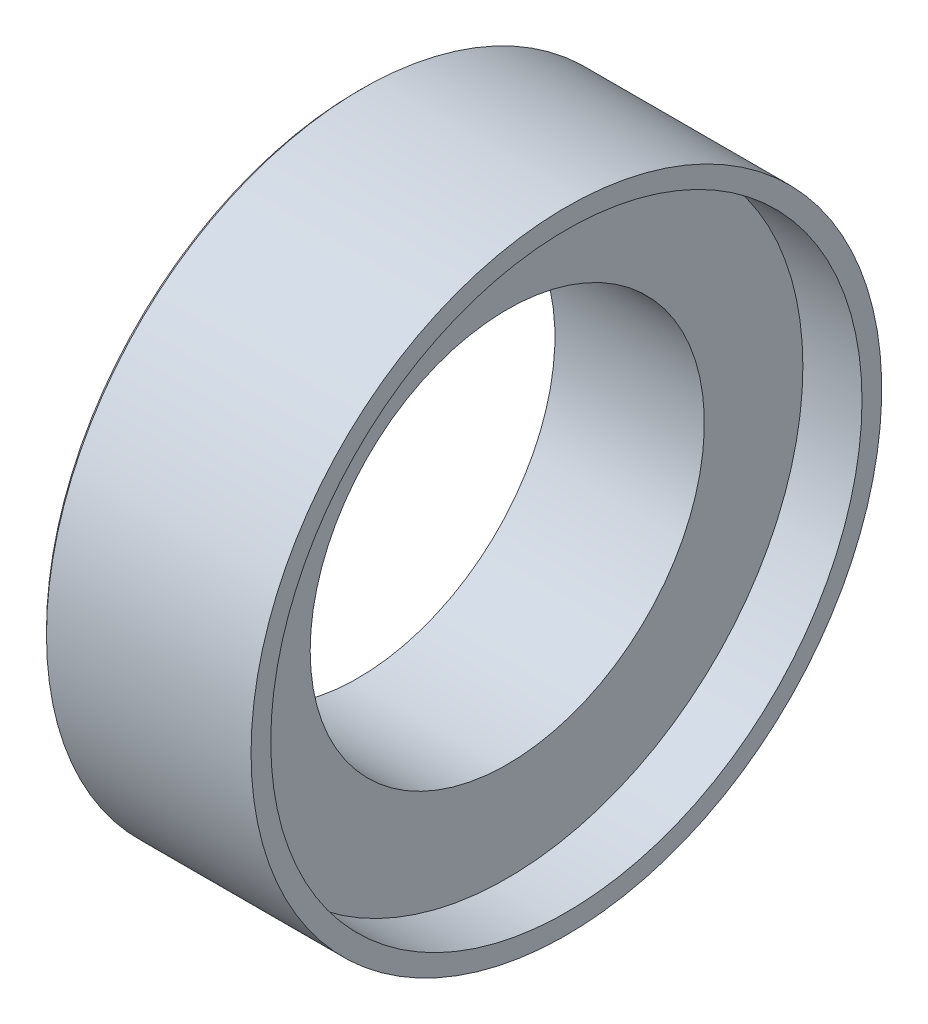
ISO-10303-21;
HEADER;
FILE_DESCRIPTION(('STEP AP214'),'2;1');
FILE_NAME('part.step','',(''),(''),'','','');
FILE_SCHEMA(('AUTOMOTIVE_DESIGN { 1 0 10303 214 1 1 1 1 }'));
ENDSEC;
DATA;
#1=APPLICATION_CONTEXT('core data for automotive mechanical design processes');
#2=APPLICATION_PROTOCOL_DEFINITION('international standard','automotive_design',2000,#1);
#3=PRODUCT_CONTEXT('',#1,'mechanical');
#4=PRODUCT('Part','Part','',(#3));
#5=PRODUCT_RELATED_PRODUCT_CATEGORY('part','',(#4));
#6=PRODUCT_DEFINITION_FORMATION('','',#4);
#7=PRODUCT_DEFINITION_CONTEXT('part definition',#1,'design');
#8=PRODUCT_DEFINITION('design','',#6,#7);
#9=PRODUCT_DEFINITION_SHAPE('','',#8);
#10=(LENGTH_UNIT() NAMED_UNIT(*) SI_UNIT(.MILLI.,.METRE.));
#11=(NAMED_UNIT(*) PLANE_ANGLE_UNIT() SI_UNIT($,.RADIAN.));
#12=(NAMED_UNIT(*) SI_UNIT($,.STERADIAN.) SOLID_ANGLE_UNIT());
#13=UNCERTAINTY_MEASURE_WITH_UNIT(LENGTH_MEASURE(1.E-05),#10,'distance_accuracy_value','');
#14=(GEOMETRIC_REPRESENTATION_CONTEXT(3) GLOBAL_UNCERTAINTY_ASSIGNED_CONTEXT((#13)) GLOBAL_UNIT_ASSIGNED_CONTEXT((#10,
#11,#12)) REPRESENTATION_CONTEXT('',''));
#15=CARTESIAN_POINT('',(0.,0.,0.));
#16=DIRECTION('',(0.,0.,1.));
#17=DIRECTION('',(1.,0.,0.));
#18=AXIS2_PLACEMENT_3D('',#15,#16,#17);
#19=CARTESIAN_POINT('',(20.79,0.,6.5));
#20=DIRECTION('',(1.,0.,0.));
#21=DIRECTION('',(0.,0.,-1.));
#22=AXIS2_PLACEMENT_3D('',#19,#20,#21);
#23=PLANE('',#22);
#24=CARTESIAN_POINT('',(20.79,0.,0.));
#25=DIRECTION('',(-1.,0.,0.));
#26=DIRECTION('',(0.,0.,1.));
#27=AXIS2_PLACEMENT_3D('',#24,#25,#26);
#28=CIRCLE('',#27,5.);
#29=CARTESIAN_POINT('',(20.79,0.,5.));
#30=VERTEX_POINT('',#29);
#31=EDGE_CURVE('E18',#30,#30,#28,.T.);
#32=ORIENTED_EDGE('',*,*,#31,.T.);
#33=EDGE_LOOP('',(#32));
#34=FACE_BOUND('',#33,.T.);
#35=CARTESIAN_POINT('',(20.79,0.,0.));
#36=DIRECTION('',(1.,0.,0.));
#37=DIRECTION('',(0.,0.,-1.));
#38=AXIS2_PLACEMENT_3D('',#35,#36,#37);
#39=CIRCLE('',#38,7.5);
#40=CARTESIAN_POINT('',(20.79,0.,-7.5));
#41=VERTEX_POINT('',#40);
#42=EDGE_CURVE('E37',#41,#41,#39,.T.);
#43=ORIENTED_EDGE('',*,*,#42,.T.);
#44=EDGE_LOOP('',(#43));
#45=FACE_BOUND('',#44,.T.);
#46=ADVANCED_FACE('F15',(#34,#45),#23,.T.);
#47=CARTESIAN_POINT('',(18.895,0.,0.));
#48=DIRECTION('',(-1.,0.,0.));
#49=DIRECTION('',(0.,0.,1.));
#50=AXIS2_PLACEMENT_3D('',#47,#48,#49);
#51=CYLINDRICAL_SURFACE('',#50,5.);
#52=ORIENTED_EDGE('',*,*,#31,.F.);
#53=EDGE_LOOP('',(#52));
#54=FACE_BOUND('',#53,.T.);
#55=CARTESIAN_POINT('',(17.,0.,0.));
#56=DIRECTION('',(-1.,0.,0.));
#57=DIRECTION('',(0.,0.,1.));
#58=AXIS2_PLACEMENT_3D('',#55,#56,#57);
#59=CIRCLE('',#58,5.);
#60=CARTESIAN_POINT('',(17.,0.,5.));
#61=VERTEX_POINT('',#60);
#62=EDGE_CURVE('E35',#61,#61,#59,.F.);
#63=ORIENTED_EDGE('',*,*,#62,.F.);
#64=EDGE_LOOP('',(#63));
#65=FACE_BOUND('',#64,.T.);
#66=ADVANCED_FACE('F45',(#54,#65),#51,.F.);
#67=CARTESIAN_POINT('',(21.54,0.,0.));
#68=DIRECTION('',(1.,0.,0.));
#69=DIRECTION('',(0.,0.,-1.));
#70=AXIS2_PLACEMENT_3D('',#67,#68,#69);
#71=CYLINDRICAL_SURFACE('',#70,7.5);
#72=ORIENTED_EDGE('',*,*,#42,.F.);
#73=EDGE_LOOP('',(#72));
#74=FACE_BOUND('',#73,.T.);
#75=CARTESIAN_POINT('',(22.29,0.,0.));
#76=DIRECTION('',(1.,0.,0.));
#77=DIRECTION('',(0.,0.,-1.));
#78=AXIS2_PLACEMENT_3D('',#75,#76,#77);
#79=CIRCLE('',#78,7.5);
#80=CARTESIAN_POINT('',(22.29,0.,-7.5));
#81=VERTEX_POINT('',#80);
#82=EDGE_CURVE('E32',#81,#81,#79,.F.);
#83=ORIENTED_EDGE('',*,*,#82,.F.);
#84=EDGE_LOOP('',(#83));
#85=FACE_BOUND('',#84,.T.);
#86=ADVANCED_FACE('F48',(#74,#85),#71,.F.);
#87=CARTESIAN_POINT('',(17.,0.,6.5));
#88=DIRECTION('',(-1.,0.,0.));
#89=DIRECTION('',(0.,0.,1.));
#90=AXIS2_PLACEMENT_3D('',#87,#88,#89);
#91=PLANE('',#90);
#92=ORIENTED_EDGE('',*,*,#62,.T.);
#93=EDGE_LOOP('',(#92));
#94=FACE_BOUND('',#93,.T.);
#95=CARTESIAN_POINT('',(17.,0.,0.));
#96=DIRECTION('',(1.,0.,0.));
#97=DIRECTION('',(0.,0.,-1.));
#98=AXIS2_PLACEMENT_3D('',#95,#96,#97);
#99=CIRCLE('',#98,7.9);
#100=CARTESIAN_POINT('',(17.,0.,-7.9));
#101=VERTEX_POINT('',#100);
#102=EDGE_CURVE('E27',#101,#101,#99,.T.);
#103=ORIENTED_EDGE('',*,*,#102,.F.);
#104=EDGE_LOOP('',(#103));
#105=FACE_BOUND('',#104,.T.);
#106=ADVANCED_FACE('F51',(#94,#105),#91,.T.);
#107=CARTESIAN_POINT('',(22.29,0.,7.75));
#108=DIRECTION('',(1.,0.,0.));
#109=DIRECTION('',(0.,0.,-1.));
#110=AXIS2_PLACEMENT_3D('',#107,#108,#109);
#111=PLANE('',#110);
#112=CARTESIAN_POINT('',(22.29,0.,0.));
#113=DIRECTION('',(-1.,0.,0.));
#114=DIRECTION('',(0.,0.,1.));
#115=AXIS2_PLACEMENT_3D('',#112,#113,#114);
#116=CIRCLE('',#115,8.);
#117=CARTESIAN_POINT('',(22.29,0.,8.));
#118=VERTEX_POINT('',#117);
#119=EDGE_CURVE('E22',#118,#118,#116,.T.);
#120=ORIENTED_EDGE('',*,*,#119,.F.);
#121=EDGE_LOOP('',(#120));
#122=FACE_BOUND('',#121,.T.);
#123=ORIENTED_EDGE('',*,*,#82,.T.);
#124=EDGE_LOOP('',(#123));
#125=FACE_BOUND('',#124,.T.);
#126=ADVANCED_FACE('F54',(#122,#125),#111,.T.);
#127=CARTESIAN_POINT('',(17.1,0.,0.));
#128=DIRECTION('',(1.,0.,0.));
#129=DIRECTION('',(0.,0.,-1.));
#130=AXIS2_PLACEMENT_3D('',#127,#128,#129);
#131=CONICAL_SURFACE('',#130,8.,0.785398163397448);
#132=ORIENTED_EDGE('',*,*,#102,.T.);
#133=EDGE_LOOP('',(#132));
#134=FACE_BOUND('',#133,.T.);
#135=CARTESIAN_POINT('',(17.1,0.,0.));
#136=DIRECTION('',(-1.,0.,0.));
#137=DIRECTION('',(0.,0.,1.));
#138=AXIS2_PLACEMENT_3D('',#135,#136,#137);
#139=CIRCLE('',#138,8.);
#140=CARTESIAN_POINT('',(17.1,0.,8.));
#141=VERTEX_POINT('',#140);
#142=EDGE_CURVE('E10',#141,#141,#139,.F.);
#143=ORIENTED_EDGE('',*,*,#142,.F.);
#144=EDGE_LOOP('',(#143));
#145=FACE_BOUND('',#144,.T.);
#146=ADVANCED_FACE('F58',(#134,#145),#131,.T.);
#147=CARTESIAN_POINT('',(18.895,0.,0.));
#148=DIRECTION('',(-1.,0.,0.));
#149=DIRECTION('',(0.,0.,1.));
#150=AXIS2_PLACEMENT_3D('',#147,#148,#149);
#151=CYLINDRICAL_SURFACE('',#150,8.);
#152=ORIENTED_EDGE('',*,*,#119,.T.);
#153=EDGE_LOOP('',(#152));
#154=FACE_BOUND('',#153,.T.);
#155=ORIENTED_EDGE('',*,*,#142,.T.);
#156=EDGE_LOOP('',(#155));
#157=FACE_BOUND('',#156,.T.);
#158=ADVANCED_FACE('F61',(#154,#157),#151,.T.);
#159=CLOSED_SHELL('',(#46,#66,#86,#106,#126,#146,#158));
#160=MANIFOLD_SOLID_BREP('B1',#159);
#161=ADVANCED_BREP_SHAPE_REPRESENTATION('',(#18,#160),#14);
#162=SHAPE_DEFINITION_REPRESENTATION(#9,#161);
ENDSEC;
END-ISO-10303-21;
